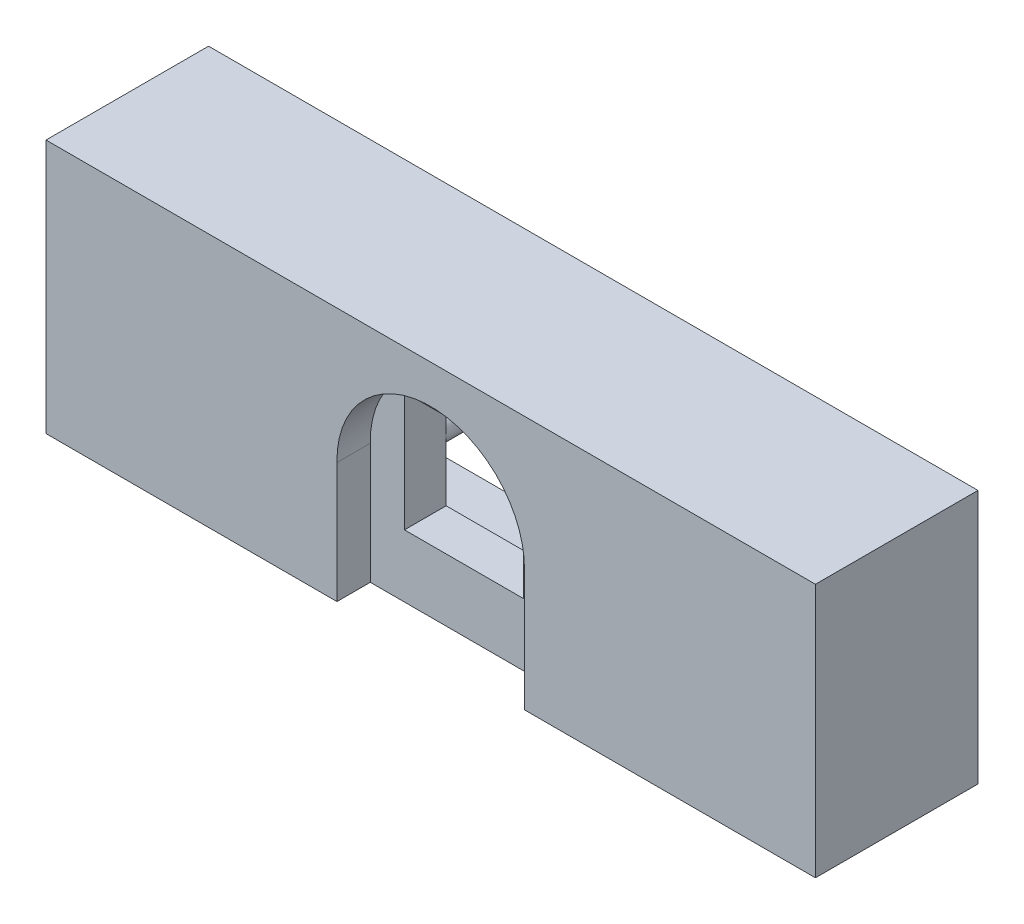
ISO-10303-21;
HEADER;
FILE_DESCRIPTION(('STEP AP214'),'2;1');
FILE_NAME('part.step','',(''),(''),'','','');
FILE_SCHEMA(('AUTOMOTIVE_DESIGN { 1 0 10303 214 1 1 1 1 }'));
ENDSEC;
DATA;
#1=APPLICATION_CONTEXT('core data for automotive mechanical design processes');
#2=APPLICATION_PROTOCOL_DEFINITION('international standard','automotive_design',2000,#1);
#3=PRODUCT_CONTEXT('',#1,'mechanical');
#4=PRODUCT('Part','Part','',(#3));
#5=PRODUCT_RELATED_PRODUCT_CATEGORY('part','',(#4));
#6=PRODUCT_DEFINITION_FORMATION('','',#4);
#7=PRODUCT_DEFINITION_CONTEXT('part definition',#1,'design');
#8=PRODUCT_DEFINITION('design','',#6,#7);
#9=PRODUCT_DEFINITION_SHAPE('','',#8);
#10=(LENGTH_UNIT() NAMED_UNIT(*) SI_UNIT(.MILLI.,.METRE.));
#11=(NAMED_UNIT(*) PLANE_ANGLE_UNIT() SI_UNIT($,.RADIAN.));
#12=(NAMED_UNIT(*) SI_UNIT($,.STERADIAN.) SOLID_ANGLE_UNIT());
#13=UNCERTAINTY_MEASURE_WITH_UNIT(LENGTH_MEASURE(1.E-05),#10,'distance_accuracy_value','');
#14=(GEOMETRIC_REPRESENTATION_CONTEXT(3) GLOBAL_UNCERTAINTY_ASSIGNED_CONTEXT((#13)) GLOBAL_UNIT_ASSIGNED_CONTEXT((#10,
#11,#12)) REPRESENTATION_CONTEXT('',''));
#15=CARTESIAN_POINT('',(0.,0.,0.));
#16=DIRECTION('',(0.,0.,1.));
#17=DIRECTION('',(1.,0.,0.));
#18=AXIS2_PLACEMENT_3D('',#15,#16,#17);
#19=CARTESIAN_POINT('',(0.,0.,4.));
#20=DIRECTION('',(0.,0.,1.));
#21=DIRECTION('',(1.,0.,0.));
#22=AXIS2_PLACEMENT_3D('',#19,#20,#21);
#23=PLANE('',#22);
#24=DIRECTION('',(-1.,0.,0.));
#25=VECTOR('',#24,1.);
#26=CARTESIAN_POINT('',(-14.15,13.85,4.));
#27=LINE('',#26,#25);
#28=CARTESIAN_POINT('',(42.15,13.85,4.));
#29=VERTEX_POINT('',#28);
#30=CARTESIAN_POINT('',(-42.15,13.85,4.));
#31=VERTEX_POINT('',#30);
#32=EDGE_CURVE('E328',#29,#31,#27,.T.);
#33=ORIENTED_EDGE('',*,*,#32,.F.);
#34=DIRECTION('',(0.,-1.,0.));
#35=VECTOR('',#34,1.);
#36=CARTESIAN_POINT('',(42.15,51.3233238451035,4.));
#37=LINE('',#36,#35);
#38=CARTESIAN_POINT('',(42.15,-12.65,4.));
#39=VERTEX_POINT('',#38);
#40=EDGE_CURVE('E253',#29,#39,#37,.T.);
#41=ORIENTED_EDGE('',*,*,#40,.T.);
#42=DIRECTION('',(1.,0.,0.));
#43=VECTOR('',#42,1.);
#44=CARTESIAN_POINT('',(14.15,-12.65,4.));
#45=LINE('',#44,#43);
#46=CARTESIAN_POINT('',(14.15,-12.65,4.));
#47=VERTEX_POINT('',#46);
#48=EDGE_CURVE('E240',#47,#39,#45,.T.);
#49=ORIENTED_EDGE('',*,*,#48,.F.);
#50=DIRECTION('',(0.,1.,0.));
#51=VECTOR('',#50,1.);
#52=CARTESIAN_POINT('',(14.15,-11.15,4.));
#53=LINE('',#52,#51);
#54=CARTESIAN_POINT('',(14.15,12.15,4.));
#55=VERTEX_POINT('',#54);
#56=EDGE_CURVE('E331',#47,#55,#53,.T.);
#57=ORIENTED_EDGE('',*,*,#56,.T.);
#58=DIRECTION('',(-1.,0.,0.));
#59=VECTOR('',#58,1.);
#60=CARTESIAN_POINT('',(-12.15,12.15,4.));
#61=LINE('',#60,#59);
#62=CARTESIAN_POINT('',(-14.15,12.15,4.));
#63=VERTEX_POINT('',#62);
#64=EDGE_CURVE('E11',#55,#63,#61,.T.);
#65=ORIENTED_EDGE('',*,*,#64,.T.);
#66=DIRECTION('',(0.,-1.,0.));
#67=VECTOR('',#66,1.);
#68=CARTESIAN_POINT('',(-14.15,16.6221359549996,4.));
#69=LINE('',#68,#67);
#70=CARTESIAN_POINT('',(-14.15,-12.65,4.));
#71=VERTEX_POINT('',#70);
#72=EDGE_CURVE('E337',#63,#71,#69,.T.);
#73=ORIENTED_EDGE('',*,*,#72,.T.);
#74=DIRECTION('',(1.,0.,0.));
#75=VECTOR('',#74,1.);
#76=CARTESIAN_POINT('',(-14.15,-12.65,4.));
#77=LINE('',#76,#75);
#78=CARTESIAN_POINT('',(-42.15,-12.65,4.));
#79=VERTEX_POINT('',#78);
#80=EDGE_CURVE('E267',#79,#71,#77,.T.);
#81=ORIENTED_EDGE('',*,*,#80,.F.);
#82=DIRECTION('',(0.,-1.,0.));
#83=VECTOR('',#82,1.);
#84=CARTESIAN_POINT('',(-42.15,51.3233238451035,4.));
#85=LINE('',#84,#83);
#86=EDGE_CURVE('E264',#31,#79,#85,.T.);
#87=ORIENTED_EDGE('',*,*,#86,.F.);
#88=EDGE_LOOP('',(#33,#41,#49,#57,#65,#73,#81,#87));
#89=FACE_BOUND('',#88,.T.);
#90=ADVANCED_FACE('F32',(#89),#23,.F.);
#91=CARTESIAN_POINT('',(0.,0.,4.));
#92=DIRECTION('',(0.,0.,1.));
#93=DIRECTION('',(1.,0.,0.));
#94=AXIS2_PLACEMENT_3D('',#91,#92,#93);
#95=PLANE('',#94);
#96=DIRECTION('',(0.,1.,0.));
#97=VECTOR('',#96,1.);
#98=CARTESIAN_POINT('',(-11.2481903363964,-0.201777491806106,4.));
#99=LINE('',#98,#97);
#100=CARTESIAN_POINT('',(-11.2481903363964,-14.65,4.));
#101=VERTEX_POINT('',#100);
#102=CARTESIAN_POINT('',(-11.2481903363964,-0.201777491806106,4.));
#103=VERTEX_POINT('',#102);
#104=EDGE_CURVE('E381',#101,#103,#99,.T.);
#105=ORIENTED_EDGE('',*,*,#104,.F.);
#106=DIRECTION('',(-1.,0.,0.));
#107=VECTOR('',#106,1.);
#108=CARTESIAN_POINT('',(11.2481903363964,-14.65,4.));
#109=LINE('',#108,#107);
#110=CARTESIAN_POINT('',(11.2481903363964,-14.65,4.));
#111=VERTEX_POINT('',#110);
#112=EDGE_CURVE('E204',#111,#101,#109,.T.);
#113=ORIENTED_EDGE('',*,*,#112,.F.);
#114=DIRECTION('',(0.,-1.,0.));
#115=VECTOR('',#114,1.);
#116=CARTESIAN_POINT('',(11.2481903363964,-0.201777491806097,4.));
#117=LINE('',#116,#115);
#118=CARTESIAN_POINT('',(11.2481903363964,-0.2017774918061,4.));
#119=VERTEX_POINT('',#118);
#120=EDGE_CURVE('E49',#119,#111,#117,.T.);
#121=ORIENTED_EDGE('',*,*,#120,.F.);
#122=CARTESIAN_POINT('',(0.,0.,4.));
#123=DIRECTION('',(0.,0.,-1.));
#124=DIRECTION('',(1.,0.,0.));
#125=AXIS2_PLACEMENT_3D('',#122,#123,#124);
#126=CIRCLE('',#125,11.25);
#127=EDGE_CURVE('E53',#103,#119,#126,.T.);
#128=ORIENTED_EDGE('',*,*,#127,.F.);
#129=EDGE_LOOP('',(#105,#113,#121,#128));
#130=FACE_BOUND('',#129,.T.);
#131=DIRECTION('',(-1.,0.,0.));
#132=VECTOR('',#131,1.);
#133=CARTESIAN_POINT('',(-7.15,7.15,4.));
#134=LINE('',#133,#132);
#135=CARTESIAN_POINT('',(7.15,7.15,4.));
#136=VERTEX_POINT('',#135);
#137=CARTESIAN_POINT('',(-7.15,7.15,4.));
#138=VERTEX_POINT('',#137);
#139=EDGE_CURVE('E367',#136,#138,#134,.T.);
#140=ORIENTED_EDGE('',*,*,#139,.F.);
#141=DIRECTION('',(0.,1.,0.));
#142=VECTOR('',#141,1.);
#143=CARTESIAN_POINT('',(7.15,7.15,4.));
#144=LINE('',#143,#142);
#145=CARTESIAN_POINT('',(7.15,-7.15,4.));
#146=VERTEX_POINT('',#145);
#147=EDGE_CURVE('E369',#146,#136,#144,.T.);
#148=ORIENTED_EDGE('',*,*,#147,.F.);
#149=DIRECTION('',(1.,0.,0.));
#150=VECTOR('',#149,1.);
#151=CARTESIAN_POINT('',(-7.15,-7.15,4.));
#152=LINE('',#151,#150);
#153=CARTESIAN_POINT('',(-7.15,-7.15,4.));
#154=VERTEX_POINT('',#153);
#155=EDGE_CURVE('E362',#154,#146,#152,.T.);
#156=ORIENTED_EDGE('',*,*,#155,.F.);
#157=DIRECTION('',(0.,-1.,0.));
#158=VECTOR('',#157,1.);
#159=CARTESIAN_POINT('',(-7.15,7.15,4.));
#160=LINE('',#159,#158);
#161=EDGE_CURVE('E364',#138,#154,#160,.T.);
#162=ORIENTED_EDGE('',*,*,#161,.F.);
#163=EDGE_LOOP('',(#140,#148,#156,#162));
#164=FACE_BOUND('',#163,.T.);
#165=ADVANCED_FACE('F445',(#130,#164),#95,.T.);
#166=CARTESIAN_POINT('',(-12.15,12.15,4.));
#167=DIRECTION('',(0.,-1.,0.));
#168=DIRECTION('',(0.,0.,-1.));
#169=AXIS2_PLACEMENT_3D('',#166,#167,#168);
#170=PLANE('',#169);
#171=DIRECTION('',(0.447213595499959,0.,0.894427190999915));
#172=VECTOR('',#171,1.);
#173=CARTESIAN_POINT('',(14.15,12.15,4.));
#174=LINE('',#173,#172);
#175=CARTESIAN_POINT('',(12.15,12.15,0.));
#176=VERTEX_POINT('',#175);
#177=EDGE_CURVE('E320',#176,#55,#174,.T.);
#178=ORIENTED_EDGE('',*,*,#177,.F.);
#179=DIRECTION('',(0.,0.,1.));
#180=VECTOR('',#179,1.);
#181=CARTESIAN_POINT('',(12.15,12.15,-1.));
#182=LINE('',#181,#180);
#183=CARTESIAN_POINT('',(12.15,12.15,-1.));
#184=VERTEX_POINT('',#183);
#185=EDGE_CURVE('E312',#184,#176,#182,.T.);
#186=ORIENTED_EDGE('',*,*,#185,.F.);
#187=DIRECTION('',(1.,0.,0.));
#188=VECTOR('',#187,1.);
#189=CARTESIAN_POINT('',(-12.15,12.15,-1.));
#190=LINE('',#189,#188);
#191=CARTESIAN_POINT('',(-12.15,12.15,-1.));
#192=VERTEX_POINT('',#191);
#193=EDGE_CURVE('E302',#192,#184,#190,.T.);
#194=ORIENTED_EDGE('',*,*,#193,.F.);
#195=DIRECTION('',(0.,0.,1.));
#196=VECTOR('',#195,1.);
#197=CARTESIAN_POINT('',(-12.15,12.15,-1.));
#198=LINE('',#197,#196);
#199=CARTESIAN_POINT('',(-12.15,12.15,0.));
#200=VERTEX_POINT('',#199);
#201=EDGE_CURVE('E309',#192,#200,#198,.T.);
#202=ORIENTED_EDGE('',*,*,#201,.T.);
#203=DIRECTION('',(0.447213595499957,0.,-0.894427190999917));
#204=VECTOR('',#203,1.);
#205=CARTESIAN_POINT('',(-12.15,12.15,0.));
#206=LINE('',#205,#204);
#207=EDGE_CURVE('E333',#63,#200,#206,.T.);
#208=ORIENTED_EDGE('',*,*,#207,.F.);
#209=ORIENTED_EDGE('',*,*,#64,.F.);
#210=EDGE_LOOP('',(#178,#186,#194,#202,#208,#209));
#211=FACE_BOUND('',#210,.T.);
#212=ADVANCED_FACE('F34',(#211),#170,.F.);
#213=CARTESIAN_POINT('',(7.15,7.15,4.));
#214=DIRECTION('',(-1.,0.,0.));
#215=DIRECTION('',(0.,-1.,0.));
#216=AXIS2_PLACEMENT_3D('',#213,#214,#215);
#217=PLANE('',#216);
#218=DIRECTION('',(0.,0.,-1.));
#219=VECTOR('',#218,1.);
#220=CARTESIAN_POINT('',(7.15,7.15,4.));
#221=LINE('',#220,#219);
#222=CARTESIAN_POINT('',(7.15,7.15,-1.));
#223=VERTEX_POINT('',#222);
#224=EDGE_CURVE('E354',#136,#223,#221,.T.);
#225=ORIENTED_EDGE('',*,*,#224,.T.);
#226=DIRECTION('',(0.,-1.,0.));
#227=VECTOR('',#226,1.);
#228=CARTESIAN_POINT('',(7.15,-7.15,-1.));
#229=LINE('',#228,#227);
#230=CARTESIAN_POINT('',(7.15,-7.15,-1.));
#231=VERTEX_POINT('',#230);
#232=EDGE_CURVE('E290',#223,#231,#229,.T.);
#233=ORIENTED_EDGE('',*,*,#232,.T.);
#234=DIRECTION('',(0.,0.,-1.));
#235=VECTOR('',#234,1.);
#236=CARTESIAN_POINT('',(7.15,-7.15,4.));
#237=LINE('',#236,#235);
#238=EDGE_CURVE('E360',#146,#231,#237,.T.);
#239=ORIENTED_EDGE('',*,*,#238,.F.);
#240=ORIENTED_EDGE('',*,*,#147,.T.);
#241=EDGE_LOOP('',(#225,#233,#239,#240));
#242=FACE_BOUND('',#241,.T.);
#243=ADVANCED_FACE('F435',(#242),#217,.T.);
#244=CARTESIAN_POINT('',(-7.15,7.15,4.));
#245=DIRECTION('',(0.,-1.,0.));
#246=DIRECTION('',(0.,0.,-1.));
#247=AXIS2_PLACEMENT_3D('',#244,#245,#246);
#248=PLANE('',#247);
#249=DIRECTION('',(0.,0.,-1.));
#250=VECTOR('',#249,1.);
#251=CARTESIAN_POINT('',(-7.15,7.15,4.));
#252=LINE('',#251,#250);
#253=CARTESIAN_POINT('',(-7.15,7.15,-1.));
#254=VERTEX_POINT('',#253);
#255=EDGE_CURVE('E356',#138,#254,#252,.T.);
#256=ORIENTED_EDGE('',*,*,#255,.T.);
#257=DIRECTION('',(1.,0.,0.));
#258=VECTOR('',#257,1.);
#259=CARTESIAN_POINT('',(7.15,7.15,-1.));
#260=LINE('',#259,#258);
#261=EDGE_CURVE('E299',#254,#223,#260,.T.);
#262=ORIENTED_EDGE('',*,*,#261,.T.);
#263=ORIENTED_EDGE('',*,*,#224,.F.);
#264=ORIENTED_EDGE('',*,*,#139,.T.);
#265=EDGE_LOOP('',(#256,#262,#263,#264));
#266=FACE_BOUND('',#265,.T.);
#267=ADVANCED_FACE('F439',(#266),#248,.T.);
#268=CARTESIAN_POINT('',(-7.15,7.15,4.));
#269=DIRECTION('',(1.,0.,0.));
#270=DIRECTION('',(0.,1.,0.));
#271=AXIS2_PLACEMENT_3D('',#268,#269,#270);
#272=PLANE('',#271);
#273=DIRECTION('',(0.,0.,-1.));
#274=VECTOR('',#273,1.);
#275=CARTESIAN_POINT('',(-7.15,-7.15,4.));
#276=LINE('',#275,#274);
#277=CARTESIAN_POINT('',(-7.15,-7.15,-1.));
#278=VERTEX_POINT('',#277);
#279=EDGE_CURVE('E358',#154,#278,#276,.T.);
#280=ORIENTED_EDGE('',*,*,#279,.T.);
#281=DIRECTION('',(0.,1.,0.));
#282=VECTOR('',#281,1.);
#283=CARTESIAN_POINT('',(-7.15,7.15,-1.));
#284=LINE('',#283,#282);
#285=EDGE_CURVE('E296',#278,#254,#284,.T.);
#286=ORIENTED_EDGE('',*,*,#285,.T.);
#287=ORIENTED_EDGE('',*,*,#255,.F.);
#288=ORIENTED_EDGE('',*,*,#161,.T.);
#289=EDGE_LOOP('',(#280,#286,#287,#288));
#290=FACE_BOUND('',#289,.T.);
#291=ADVANCED_FACE('F443',(#290),#272,.T.);
#292=CARTESIAN_POINT('',(-7.15,-7.15,4.));
#293=DIRECTION('',(0.,1.,0.));
#294=DIRECTION('',(0.,0.,1.));
#295=AXIS2_PLACEMENT_3D('',#292,#293,#294);
#296=PLANE('',#295);
#297=ORIENTED_EDGE('',*,*,#238,.T.);
#298=DIRECTION('',(-1.,0.,0.));
#299=VECTOR('',#298,1.);
#300=CARTESIAN_POINT('',(-7.15,-7.15,-1.));
#301=LINE('',#300,#299);
#302=EDGE_CURVE('E293',#231,#278,#301,.T.);
#303=ORIENTED_EDGE('',*,*,#302,.T.);
#304=ORIENTED_EDGE('',*,*,#279,.F.);
#305=ORIENTED_EDGE('',*,*,#155,.T.);
#306=EDGE_LOOP('',(#297,#303,#304,#305));
#307=FACE_BOUND('',#306,.T.);
#308=ADVANCED_FACE('F430',(#307),#296,.T.);
#309=CARTESIAN_POINT('',(-11.2481903363964,-0.201777491806106,8.));
#310=DIRECTION('',(-1.,0.,0.));
#311=DIRECTION('',(0.,0.,1.));
#312=AXIS2_PLACEMENT_3D('',#309,#310,#311);
#313=PLANE('',#312);
#314=ORIENTED_EDGE('',*,*,#104,.T.);
#315=DIRECTION('',(0.,0.,-1.));
#316=VECTOR('',#315,1.);
#317=CARTESIAN_POINT('',(-11.2481903363964,-0.201777491806106,8.));
#318=LINE('',#317,#316);
#319=CARTESIAN_POINT('',(-11.2481903363964,-0.201777491806106,8.));
#320=VERTEX_POINT('',#319);
#321=EDGE_CURVE('E186',#320,#103,#318,.T.);
#322=ORIENTED_EDGE('',*,*,#321,.F.);
#323=DIRECTION('',(0.,1.,0.));
#324=VECTOR('',#323,1.);
#325=CARTESIAN_POINT('',(-11.2481903363964,-0.201777491806106,8.));
#326=LINE('',#325,#324);
#327=CARTESIAN_POINT('',(-11.2481903363964,-14.65,8.));
#328=VERTEX_POINT('',#327);
#329=EDGE_CURVE('E180',#328,#320,#326,.T.);
#330=ORIENTED_EDGE('',*,*,#329,.F.);
#331=DIRECTION('',(0.,0.,1.));
#332=VECTOR('',#331,1.);
#333=CARTESIAN_POINT('',(-11.2481903363964,-14.65,4.));
#334=LINE('',#333,#332);
#335=EDGE_CURVE('E184',#101,#328,#334,.T.);
#336=ORIENTED_EDGE('',*,*,#335,.F.);
#337=EDGE_LOOP('',(#314,#322,#330,#336));
#338=FACE_BOUND('',#337,.T.);
#339=ADVANCED_FACE('F182',(#338),#313,.F.);
#340=CARTESIAN_POINT('',(0.,0.,8.));
#341=DIRECTION('',(0.,0.,-1.));
#342=DIRECTION('',(-1.,0.,0.));
#343=AXIS2_PLACEMENT_3D('',#340,#341,#342);
#344=CYLINDRICAL_SURFACE('',#343,11.25);
#345=ORIENTED_EDGE('',*,*,#127,.T.);
#346=DIRECTION('',(0.,0.,-1.));
#347=VECTOR('',#346,1.);
#348=CARTESIAN_POINT('',(11.2481903363964,-0.2017774918061,8.));
#349=LINE('',#348,#347);
#350=CARTESIAN_POINT('',(11.2481903363964,-0.2017774918061,8.));
#351=VERTEX_POINT('',#350);
#352=EDGE_CURVE('E325',#351,#119,#349,.T.);
#353=ORIENTED_EDGE('',*,*,#352,.F.);
#354=CARTESIAN_POINT('',(0.,0.,8.));
#355=DIRECTION('',(0.,0.,-1.));
#356=DIRECTION('',(1.,0.,0.));
#357=AXIS2_PLACEMENT_3D('',#354,#355,#356);
#358=CIRCLE('',#357,11.25);
#359=EDGE_CURVE('E189',#320,#351,#358,.T.);
#360=ORIENTED_EDGE('',*,*,#359,.F.);
#361=ORIENTED_EDGE('',*,*,#321,.T.);
#362=EDGE_LOOP('',(#345,#353,#360,#361));
#363=FACE_BOUND('',#362,.T.);
#364=ADVANCED_FACE('F479',(#363),#344,.F.);
#365=CARTESIAN_POINT('',(11.2481903363964,-0.201777491806097,8.));
#366=DIRECTION('',(1.,0.,0.));
#367=DIRECTION('',(0.,0.,-1.));
#368=AXIS2_PLACEMENT_3D('',#365,#366,#367);
#369=PLANE('',#368);
#370=ORIENTED_EDGE('',*,*,#120,.T.);
#371=DIRECTION('',(0.,0.,-1.));
#372=VECTOR('',#371,1.);
#373=CARTESIAN_POINT('',(11.2481903363964,-14.65,8.));
#374=LINE('',#373,#372);
#375=CARTESIAN_POINT('',(11.2481903363964,-14.65,8.));
#376=VERTEX_POINT('',#375);
#377=EDGE_CURVE('E224',#376,#111,#374,.T.);
#378=ORIENTED_EDGE('',*,*,#377,.F.);
#379=DIRECTION('',(0.,-1.,0.));
#380=VECTOR('',#379,1.);
#381=CARTESIAN_POINT('',(11.2481903363964,-0.201777491806097,8.));
#382=LINE('',#381,#380);
#383=EDGE_CURVE('E323',#351,#376,#382,.T.);
#384=ORIENTED_EDGE('',*,*,#383,.F.);
#385=ORIENTED_EDGE('',*,*,#352,.T.);
#386=EDGE_LOOP('',(#370,#378,#384,#385));
#387=FACE_BOUND('',#386,.T.);
#388=ADVANCED_FACE('F482',(#387),#369,.F.);
#389=CARTESIAN_POINT('',(0.,0.,8.));
#390=DIRECTION('',(0.,0.,1.));
#391=DIRECTION('',(1.,0.,0.));
#392=AXIS2_PLACEMENT_3D('',#389,#390,#391);
#393=PLANE('',#392);
#394=ORIENTED_EDGE('',*,*,#383,.T.);
#395=DIRECTION('',(-1.,0.,0.));
#396=VECTOR('',#395,1.);
#397=CARTESIAN_POINT('',(46.15,-14.65,8.));
#398=LINE('',#397,#396);
#399=CARTESIAN_POINT('',(46.15,-14.65,8.));
#400=VERTEX_POINT('',#399);
#401=EDGE_CURVE('E221',#400,#376,#398,.T.);
#402=ORIENTED_EDGE('',*,*,#401,.F.);
#403=DIRECTION('',(0.,-1.,0.));
#404=VECTOR('',#403,1.);
#405=CARTESIAN_POINT('',(46.15,51.3233238451035,8.));
#406=LINE('',#405,#404);
#407=CARTESIAN_POINT('',(46.15,15.85,8.));
#408=VERTEX_POINT('',#407);
#409=EDGE_CURVE('E247',#408,#400,#406,.T.);
#410=ORIENTED_EDGE('',*,*,#409,.F.);
#411=DIRECTION('',(1.,0.,0.));
#412=VECTOR('',#411,1.);
#413=CARTESIAN_POINT('',(-46.15,15.85,8.));
#414=LINE('',#413,#412);
#415=CARTESIAN_POINT('',(-46.15,15.85,8.));
#416=VERTEX_POINT('',#415);
#417=EDGE_CURVE('E234',#416,#408,#414,.T.);
#418=ORIENTED_EDGE('',*,*,#417,.F.);
#419=DIRECTION('',(0.,-1.,0.));
#420=VECTOR('',#419,1.);
#421=CARTESIAN_POINT('',(-46.15,51.3233238451035,8.));
#422=LINE('',#421,#420);
#423=CARTESIAN_POINT('',(-46.15,-14.65,8.));
#424=VERTEX_POINT('',#423);
#425=EDGE_CURVE('E195',#416,#424,#422,.T.);
#426=ORIENTED_EDGE('',*,*,#425,.T.);
#427=DIRECTION('',(-1.,0.,0.));
#428=VECTOR('',#427,1.);
#429=CARTESIAN_POINT('',(-11.2481903363964,-14.65,8.));
#430=LINE('',#429,#428);
#431=EDGE_CURVE('E192',#328,#424,#430,.T.);
#432=ORIENTED_EDGE('',*,*,#431,.F.);
#433=ORIENTED_EDGE('',*,*,#329,.T.);
#434=ORIENTED_EDGE('',*,*,#359,.T.);
#435=EDGE_LOOP('',(#394,#402,#410,#418,#426,#432,#433,#434));
#436=FACE_BOUND('',#435,.T.);
#437=ADVANCED_FACE('F193',(#436),#393,.T.);
#438=CARTESIAN_POINT('',(-12.15,16.6221359549996,0.));
#439=DIRECTION('',(0.894427190999916,0.,0.447213595499957));
#440=DIRECTION('',(0.447213595499957,0.,-0.894427190999917));
#441=AXIS2_PLACEMENT_3D('',#438,#439,#440);
#442=PLANE('',#441);
#443=ORIENTED_EDGE('',*,*,#72,.F.);
#444=ORIENTED_EDGE('',*,*,#207,.T.);
#445=DIRECTION('',(0.,-1.,0.));
#446=VECTOR('',#445,1.);
#447=CARTESIAN_POINT('',(-12.15,12.15,0.));
#448=LINE('',#447,#446);
#449=CARTESIAN_POINT('',(-12.15,-12.65,0.));
#450=VERTEX_POINT('',#449);
#451=EDGE_CURVE('E41',#200,#450,#448,.T.);
#452=ORIENTED_EDGE('',*,*,#451,.T.);
#453=DIRECTION('',(0.447213595499957,0.,-0.894427190999916));
#454=VECTOR('',#453,1.);
#455=CARTESIAN_POINT('',(-14.15,-12.65,4.));
#456=LINE('',#455,#454);
#457=EDGE_CURVE('E263',#71,#450,#456,.T.);
#458=ORIENTED_EDGE('',*,*,#457,.F.);
#459=EDGE_LOOP('',(#443,#444,#452,#458));
#460=FACE_BOUND('',#459,.T.);
#461=ADVANCED_FACE('F415',(#460),#442,.F.);
#462=CARTESIAN_POINT('',(14.15,16.6221359549996,4.));
#463=DIRECTION('',(-0.894427190999915,0.,0.447213595499959));
#464=DIRECTION('',(0.447213595499959,0.,0.894427190999915));
#465=AXIS2_PLACEMENT_3D('',#462,#463,#464);
#466=PLANE('',#465);
#467=DIRECTION('',(0.,-1.,0.));
#468=VECTOR('',#467,1.);
#469=CARTESIAN_POINT('',(12.15,16.6221359549996,0.));
#470=LINE('',#469,#468);
#471=CARTESIAN_POINT('',(12.15,-12.65,0.));
#472=VERTEX_POINT('',#471);
#473=EDGE_CURVE('E319',#176,#472,#470,.T.);
#474=ORIENTED_EDGE('',*,*,#473,.F.);
#475=ORIENTED_EDGE('',*,*,#177,.T.);
#476=ORIENTED_EDGE('',*,*,#56,.F.);
#477=DIRECTION('',(0.447213595499959,0.,0.894427190999915));
#478=VECTOR('',#477,1.);
#479=CARTESIAN_POINT('',(12.15,-12.65,0.));
#480=LINE('',#479,#478);
#481=EDGE_CURVE('E287',#472,#47,#480,.T.);
#482=ORIENTED_EDGE('',*,*,#481,.F.);
#483=EDGE_LOOP('',(#474,#475,#476,#482));
#484=FACE_BOUND('',#483,.T.);
#485=ADVANCED_FACE('F403',(#484),#466,.F.);
#486=CARTESIAN_POINT('',(0.,0.,-1.));
#487=DIRECTION('',(0.,0.,-1.));
#488=DIRECTION('',(-1.,0.,0.));
#489=AXIS2_PLACEMENT_3D('',#486,#487,#488);
#490=PLANE('',#489);
#491=CARTESIAN_POINT('',(-8.75,0.,-1.));
#492=DIRECTION('',(0.,0.,-1.));
#493=DIRECTION('',(-1.,0.,0.));
#494=AXIS2_PLACEMENT_3D('',#491,#492,#493);
#495=CIRCLE('',#494,1.5);
#496=CARTESIAN_POINT('',(-10.25,0.,-1.));
#497=VERTEX_POINT('',#496);
#498=EDGE_CURVE('E316',#497,#497,#495,.T.);
#499=ORIENTED_EDGE('',*,*,#498,.F.);
#500=EDGE_LOOP('',(#499));
#501=FACE_BOUND('',#500,.T.);
#502=CARTESIAN_POINT('',(8.75,0.,-1.));
#503=DIRECTION('',(0.,0.,-1.));
#504=DIRECTION('',(-1.,0.,0.));
#505=AXIS2_PLACEMENT_3D('',#502,#503,#504);
#506=CIRCLE('',#505,1.5);
#507=CARTESIAN_POINT('',(7.25,0.,-1.));
#508=VERTEX_POINT('',#507);
#509=EDGE_CURVE('E315',#508,#508,#506,.T.);
#510=ORIENTED_EDGE('',*,*,#509,.F.);
#511=EDGE_LOOP('',(#510));
#512=FACE_BOUND('',#511,.T.);
#513=ORIENTED_EDGE('',*,*,#193,.T.);
#514=DIRECTION('',(0.,-1.,0.));
#515=VECTOR('',#514,1.);
#516=CARTESIAN_POINT('',(12.15,12.15,-1.));
#517=LINE('',#516,#515);
#518=CARTESIAN_POINT('',(12.15,-12.65,-1.));
#519=VERTEX_POINT('',#518);
#520=EDGE_CURVE('E305',#184,#519,#517,.T.);
#521=ORIENTED_EDGE('',*,*,#520,.T.);
#522=DIRECTION('',(1.,0.,0.));
#523=VECTOR('',#522,1.);
#524=CARTESIAN_POINT('',(-12.15,-12.65,-1.));
#525=LINE('',#524,#523);
#526=CARTESIAN_POINT('',(-12.15,-12.65,-1.));
#527=VERTEX_POINT('',#526);
#528=EDGE_CURVE('E281',#527,#519,#525,.T.);
#529=ORIENTED_EDGE('',*,*,#528,.F.);
#530=DIRECTION('',(0.,1.,0.));
#531=VECTOR('',#530,1.);
#532=CARTESIAN_POINT('',(-12.15,-11.15,-1.));
#533=LINE('',#532,#531);
#534=EDGE_CURVE('E307',#527,#192,#533,.T.);
#535=ORIENTED_EDGE('',*,*,#534,.T.);
#536=EDGE_LOOP('',(#513,#521,#529,#535));
#537=FACE_BOUND('',#536,.T.);
#538=ORIENTED_EDGE('',*,*,#302,.F.);
#539=ORIENTED_EDGE('',*,*,#232,.F.);
#540=ORIENTED_EDGE('',*,*,#261,.F.);
#541=ORIENTED_EDGE('',*,*,#285,.F.);
#542=EDGE_LOOP('',(#538,#539,#540,#541));
#543=FACE_BOUND('',#542,.T.);
#544=ADVANCED_FACE('F420',(#501,#512,#537,#543),#490,.T.);
#545=CARTESIAN_POINT('',(12.15,12.15,-1.));
#546=DIRECTION('',(-1.,0.,0.));
#547=DIRECTION('',(0.,0.,1.));
#548=AXIS2_PLACEMENT_3D('',#545,#546,#547);
#549=PLANE('',#548);
#550=ORIENTED_EDGE('',*,*,#473,.T.);
#551=DIRECTION('',(0.,0.,1.));
#552=VECTOR('',#551,1.);
#553=CARTESIAN_POINT('',(12.15,-12.65,-1.));
#554=LINE('',#553,#552);
#555=EDGE_CURVE('E284',#519,#472,#554,.T.);
#556=ORIENTED_EDGE('',*,*,#555,.F.);
#557=ORIENTED_EDGE('',*,*,#520,.F.);
#558=ORIENTED_EDGE('',*,*,#185,.T.);
#559=EDGE_LOOP('',(#550,#556,#557,#558));
#560=FACE_BOUND('',#559,.T.);
#561=ADVANCED_FACE('F407',(#560),#549,.F.);
#562=CARTESIAN_POINT('',(-12.15,-11.15,-1.));
#563=DIRECTION('',(1.,0.,0.));
#564=DIRECTION('',(0.,0.,-1.));
#565=AXIS2_PLACEMENT_3D('',#562,#563,#564);
#566=PLANE('',#565);
#567=ORIENTED_EDGE('',*,*,#451,.F.);
#568=ORIENTED_EDGE('',*,*,#201,.F.);
#569=ORIENTED_EDGE('',*,*,#534,.F.);
#570=DIRECTION('',(0.,0.,-1.));
#571=VECTOR('',#570,1.);
#572=CARTESIAN_POINT('',(-12.15,-12.65,0.));
#573=LINE('',#572,#571);
#574=EDGE_CURVE('E278',#450,#527,#573,.T.);
#575=ORIENTED_EDGE('',*,*,#574,.F.);
#576=EDGE_LOOP('',(#567,#568,#569,#575));
#577=FACE_BOUND('',#576,.T.);
#578=ADVANCED_FACE('F418',(#577),#566,.F.);
#579=CARTESIAN_POINT('',(8.75,0.,-4.));
#580=DIRECTION('',(0.,0.,1.));
#581=DIRECTION('',(1.,0.,0.));
#582=AXIS2_PLACEMENT_3D('',#579,#580,#581);
#583=PLANE('',#582);
#584=CARTESIAN_POINT('',(8.75,0.,-4.));
#585=DIRECTION('',(0.,0.,-1.));
#586=DIRECTION('',(1.,0.,0.));
#587=AXIS2_PLACEMENT_3D('',#584,#585,#586);
#588=CIRCLE('',#587,1.5);
#589=CARTESIAN_POINT('',(10.25,0.,-4.));
#590=VERTEX_POINT('',#589);
#591=EDGE_CURVE('E374',#590,#590,#588,.T.);
#592=ORIENTED_EDGE('',*,*,#591,.T.);
#593=EDGE_LOOP('',(#592));
#594=FACE_BOUND('',#593,.T.);
#595=ADVANCED_FACE('F473',(#594),#583,.F.);
#596=CARTESIAN_POINT('',(8.75,0.,-4.));
#597=DIRECTION('',(0.,0.,1.));
#598=DIRECTION('',(1.,0.,0.));
#599=AXIS2_PLACEMENT_3D('',#596,#597,#598);
#600=CYLINDRICAL_SURFACE('',#599,1.5);
#601=ORIENTED_EDGE('',*,*,#509,.T.);
#602=EDGE_LOOP('',(#601));
#603=FACE_BOUND('',#602,.T.);
#604=ORIENTED_EDGE('',*,*,#591,.F.);
#605=EDGE_LOOP('',(#604));
#606=FACE_BOUND('',#605,.T.);
#607=ADVANCED_FACE('F469',(#603,#606),#600,.T.);
#608=CARTESIAN_POINT('',(-8.75,0.,-4.));
#609=DIRECTION('',(0.,0.,-1.));
#610=DIRECTION('',(-1.,0.,0.));
#611=AXIS2_PLACEMENT_3D('',#608,#609,#610);
#612=PLANE('',#611);
#613=CARTESIAN_POINT('',(-8.75,0.,-4.));
#614=DIRECTION('',(0.,0.,-1.));
#615=DIRECTION('',(-1.,0.,0.));
#616=AXIS2_PLACEMENT_3D('',#613,#614,#615);
#617=CIRCLE('',#616,1.5);
#618=CARTESIAN_POINT('',(-10.25,0.,-4.));
#619=VERTEX_POINT('',#618);
#620=EDGE_CURVE('E371',#619,#619,#617,.T.);
#621=ORIENTED_EDGE('',*,*,#620,.T.);
#622=EDGE_LOOP('',(#621));
#623=FACE_BOUND('',#622,.T.);
#624=ADVANCED_FACE('F465',(#623),#612,.T.);
#625=CARTESIAN_POINT('',(-8.75,0.,-4.));
#626=DIRECTION('',(0.,0.,1.));
#627=DIRECTION('',(1.,0.,0.));
#628=AXIS2_PLACEMENT_3D('',#625,#626,#627);
#629=CYLINDRICAL_SURFACE('',#628,1.5);
#630=ORIENTED_EDGE('',*,*,#498,.T.);
#631=EDGE_LOOP('',(#630));
#632=FACE_BOUND('',#631,.T.);
#633=ORIENTED_EDGE('',*,*,#620,.F.);
#634=EDGE_LOOP('',(#633));
#635=FACE_BOUND('',#634,.T.);
#636=ADVANCED_FACE('F462',(#632,#635),#629,.T.);
#637=CARTESIAN_POINT('',(-42.15,51.3233238451035,4.));
#638=DIRECTION('',(1.,0.,0.));
#639=DIRECTION('',(0.,1.,0.));
#640=AXIS2_PLACEMENT_3D('',#637,#638,#639);
#641=PLANE('',#640);
#642=DIRECTION('',(0.,0.,-1.));
#643=VECTOR('',#642,1.);
#644=CARTESIAN_POINT('',(-42.15,13.85,4.));
#645=LINE('',#644,#643);
#646=CARTESIAN_POINT('',(-42.15,13.85,-11.5));
#647=VERTEX_POINT('',#646);
#648=EDGE_CURVE('E260',#31,#647,#645,.T.);
#649=ORIENTED_EDGE('',*,*,#648,.F.);
#650=ORIENTED_EDGE('',*,*,#86,.T.);
#651=DIRECTION('',(0.,0.,1.));
#652=VECTOR('',#651,1.);
#653=CARTESIAN_POINT('',(-42.15,-12.65,4.));
#654=LINE('',#653,#652);
#655=CARTESIAN_POINT('',(-42.15,-12.65,-11.5));
#656=VERTEX_POINT('',#655);
#657=EDGE_CURVE('E246',#656,#79,#654,.T.);
#658=ORIENTED_EDGE('',*,*,#657,.F.);
#659=DIRECTION('',(0.,-1.,0.));
#660=VECTOR('',#659,1.);
#661=CARTESIAN_POINT('',(-42.15,51.3233238451035,-11.5));
#662=LINE('',#661,#660);
#663=EDGE_CURVE('E271',#647,#656,#662,.T.);
#664=ORIENTED_EDGE('',*,*,#663,.F.);
#665=EDGE_LOOP('',(#649,#650,#658,#664));
#666=FACE_BOUND('',#665,.T.);
#667=ADVANCED_FACE('F391',(#666),#641,.T.);
#668=CARTESIAN_POINT('',(-46.15,51.3233238451035,-11.5));
#669=DIRECTION('',(0.,0.,-1.));
#670=DIRECTION('',(-1.,0.,0.));
#671=AXIS2_PLACEMENT_3D('',#668,#669,#670);
#672=PLANE('',#671);
#673=ORIENTED_EDGE('',*,*,#663,.T.);
#674=DIRECTION('',(1.,0.,0.));
#675=VECTOR('',#674,1.);
#676=CARTESIAN_POINT('',(42.15,-12.65,-11.5));
#677=LINE('',#676,#675);
#678=CARTESIAN_POINT('',(42.15,-12.65,-11.5));
#679=VERTEX_POINT('',#678);
#680=EDGE_CURVE('E205',#656,#679,#677,.T.);
#681=ORIENTED_EDGE('',*,*,#680,.T.);
#682=DIRECTION('',(0.,-1.,0.));
#683=VECTOR('',#682,1.);
#684=CARTESIAN_POINT('',(42.15,51.3233238451035,-11.5));
#685=LINE('',#684,#683);
#686=CARTESIAN_POINT('',(42.15,13.85,-11.5));
#687=VERTEX_POINT('',#686);
#688=EDGE_CURVE('E257',#687,#679,#685,.T.);
#689=ORIENTED_EDGE('',*,*,#688,.F.);
#690=DIRECTION('',(-1.,0.,0.));
#691=VECTOR('',#690,1.);
#692=CARTESIAN_POINT('',(-42.15,13.85,-11.5));
#693=LINE('',#692,#691);
#694=EDGE_CURVE('E226',#687,#647,#693,.T.);
#695=ORIENTED_EDGE('',*,*,#694,.T.);
#696=EDGE_LOOP('',(#673,#681,#689,#695));
#697=FACE_BOUND('',#696,.T.);
#698=DIRECTION('',(0.,-1.,0.));
#699=VECTOR('',#698,1.);
#700=CARTESIAN_POINT('',(-46.15,51.3233238451035,-11.5));
#701=LINE('',#700,#699);
#702=CARTESIAN_POINT('',(-46.15,15.85,-11.5));
#703=VERTEX_POINT('',#702);
#704=CARTESIAN_POINT('',(-46.15,-14.65,-11.5));
#705=VERTEX_POINT('',#704);
#706=EDGE_CURVE('E273',#703,#705,#701,.T.);
#707=ORIENTED_EDGE('',*,*,#706,.F.);
#708=DIRECTION('',(-1.,0.,0.));
#709=VECTOR('',#708,1.);
#710=CARTESIAN_POINT('',(46.15,15.85,-11.5));
#711=LINE('',#710,#709);
#712=CARTESIAN_POINT('',(46.15,15.85,-11.5));
#713=VERTEX_POINT('',#712);
#714=EDGE_CURVE('E228',#713,#703,#711,.T.);
#715=ORIENTED_EDGE('',*,*,#714,.F.);
#716=DIRECTION('',(0.,-1.,0.));
#717=VECTOR('',#716,1.);
#718=CARTESIAN_POINT('',(46.15,51.3233238451035,-11.5));
#719=LINE('',#718,#717);
#720=CARTESIAN_POINT('',(46.15,-14.65,-11.5));
#721=VERTEX_POINT('',#720);
#722=EDGE_CURVE('E255',#713,#721,#719,.T.);
#723=ORIENTED_EDGE('',*,*,#722,.T.);
#724=DIRECTION('',(1.,0.,0.));
#725=VECTOR('',#724,1.);
#726=CARTESIAN_POINT('',(-46.15,-14.65,-11.5));
#727=LINE('',#726,#725);
#728=EDGE_CURVE('E215',#705,#721,#727,.T.);
#729=ORIENTED_EDGE('',*,*,#728,.F.);
#730=EDGE_LOOP('',(#707,#715,#723,#729));
#731=FACE_BOUND('',#730,.T.);
#732=ADVANCED_FACE('F394',(#697,#731),#672,.T.);
#733=CARTESIAN_POINT('',(-46.15,51.3233238451035,8.));
#734=DIRECTION('',(-1.,0.,0.));
#735=DIRECTION('',(0.,-1.,0.));
#736=AXIS2_PLACEMENT_3D('',#733,#734,#735);
#737=PLANE('',#736);
#738=ORIENTED_EDGE('',*,*,#425,.F.);
#739=DIRECTION('',(0.,0.,1.));
#740=VECTOR('',#739,1.);
#741=CARTESIAN_POINT('',(-46.15,15.85,-11.5));
#742=LINE('',#741,#740);
#743=EDGE_CURVE('E231',#703,#416,#742,.T.);
#744=ORIENTED_EDGE('',*,*,#743,.F.);
#745=ORIENTED_EDGE('',*,*,#706,.T.);
#746=DIRECTION('',(0.,0.,-1.));
#747=VECTOR('',#746,1.);
#748=CARTESIAN_POINT('',(-46.15,-14.65,8.));
#749=LINE('',#748,#747);
#750=EDGE_CURVE('E199',#424,#705,#749,.T.);
#751=ORIENTED_EDGE('',*,*,#750,.F.);
#752=EDGE_LOOP('',(#738,#744,#745,#751));
#753=FACE_BOUND('',#752,.T.);
#754=ADVANCED_FACE('F497',(#753),#737,.T.);
#755=CARTESIAN_POINT('',(46.15,51.3233238451035,8.));
#756=DIRECTION('',(1.,0.,0.));
#757=DIRECTION('',(0.,1.,0.));
#758=AXIS2_PLACEMENT_3D('',#755,#756,#757);
#759=PLANE('',#758);
#760=ORIENTED_EDGE('',*,*,#722,.F.);
#761=DIRECTION('',(0.,0.,-1.));
#762=VECTOR('',#761,1.);
#763=CARTESIAN_POINT('',(46.15,15.85,8.));
#764=LINE('',#763,#762);
#765=EDGE_CURVE('E237',#408,#713,#764,.T.);
#766=ORIENTED_EDGE('',*,*,#765,.F.);
#767=ORIENTED_EDGE('',*,*,#409,.T.);
#768=DIRECTION('',(0.,0.,1.));
#769=VECTOR('',#768,1.);
#770=CARTESIAN_POINT('',(46.15,-14.65,-11.5));
#771=LINE('',#770,#769);
#772=EDGE_CURVE('E218',#721,#400,#771,.T.);
#773=ORIENTED_EDGE('',*,*,#772,.F.);
#774=EDGE_LOOP('',(#760,#766,#767,#773));
#775=FACE_BOUND('',#774,.T.);
#776=ADVANCED_FACE('F500',(#775),#759,.T.);
#777=CARTESIAN_POINT('',(42.15,51.3233238451035,4.));
#778=DIRECTION('',(-1.,0.,0.));
#779=DIRECTION('',(0.,-1.,0.));
#780=AXIS2_PLACEMENT_3D('',#777,#778,#779);
#781=PLANE('',#780);
#782=DIRECTION('',(0.,0.,1.));
#783=VECTOR('',#782,1.);
#784=CARTESIAN_POINT('',(42.15,13.85,4.));
#785=LINE('',#784,#783);
#786=EDGE_CURVE('E243',#687,#29,#785,.T.);
#787=ORIENTED_EDGE('',*,*,#786,.F.);
#788=ORIENTED_EDGE('',*,*,#688,.T.);
#789=DIRECTION('',(0.,0.,-1.));
#790=VECTOR('',#789,1.);
#791=CARTESIAN_POINT('',(42.15,-12.65,4.));
#792=LINE('',#791,#790);
#793=EDGE_CURVE('E250',#39,#679,#792,.T.);
#794=ORIENTED_EDGE('',*,*,#793,.F.);
#795=ORIENTED_EDGE('',*,*,#40,.F.);
#796=EDGE_LOOP('',(#787,#788,#794,#795));
#797=FACE_BOUND('',#796,.T.);
#798=ADVANCED_FACE('F398',(#797),#781,.T.);
#799=CARTESIAN_POINT('',(0.,13.85,0.));
#800=DIRECTION('',(0.,1.,0.));
#801=DIRECTION('',(0.,0.,1.));
#802=AXIS2_PLACEMENT_3D('',#799,#800,#801);
#803=PLANE('',#802);
#804=ORIENTED_EDGE('',*,*,#32,.T.);
#805=ORIENTED_EDGE('',*,*,#648,.T.);
#806=ORIENTED_EDGE('',*,*,#694,.F.);
#807=ORIENTED_EDGE('',*,*,#786,.T.);
#808=EDGE_LOOP('',(#804,#805,#806,#807));
#809=FACE_BOUND('',#808,.T.);
#810=ADVANCED_FACE('F385',(#809),#803,.F.);
#811=CARTESIAN_POINT('',(0.,15.85,0.));
#812=DIRECTION('',(0.,1.,0.));
#813=DIRECTION('',(0.,0.,1.));
#814=AXIS2_PLACEMENT_3D('',#811,#812,#813);
#815=PLANE('',#814);
#816=ORIENTED_EDGE('',*,*,#714,.T.);
#817=ORIENTED_EDGE('',*,*,#743,.T.);
#818=ORIENTED_EDGE('',*,*,#417,.T.);
#819=ORIENTED_EDGE('',*,*,#765,.T.);
#820=EDGE_LOOP('',(#816,#817,#818,#819));
#821=FACE_BOUND('',#820,.T.);
#822=ADVANCED_FACE('F513',(#821),#815,.T.);
#823=CARTESIAN_POINT('',(0.,-12.65,0.));
#824=DIRECTION('',(0.,-1.,0.));
#825=DIRECTION('',(1.,0.,0.));
#826=AXIS2_PLACEMENT_3D('',#823,#824,#825);
#827=PLANE('',#826);
#828=CARTESIAN_POINT('',(26.2481903363964,-12.65,-7.5));
#829=DIRECTION('',(0.,-1.,0.));
#830=DIRECTION('',(1.,0.,0.));
#831=AXIS2_PLACEMENT_3D('',#828,#829,#830);
#832=CIRCLE('',#831,1.6);
#833=CARTESIAN_POINT('',(27.8481903363964,-12.65,-7.5));
#834=VERTEX_POINT('',#833);
#835=EDGE_CURVE('E208',#834,#834,#832,.T.);
#836=ORIENTED_EDGE('',*,*,#835,.T.);
#837=EDGE_LOOP('',(#836));
#838=FACE_BOUND('',#837,.T.);
#839=ORIENTED_EDGE('',*,*,#680,.F.);
#840=ORIENTED_EDGE('',*,*,#657,.T.);
#841=ORIENTED_EDGE('',*,*,#80,.T.);
#842=ORIENTED_EDGE('',*,*,#457,.T.);
#843=ORIENTED_EDGE('',*,*,#574,.T.);
#844=ORIENTED_EDGE('',*,*,#528,.T.);
#845=ORIENTED_EDGE('',*,*,#555,.T.);
#846=ORIENTED_EDGE('',*,*,#481,.T.);
#847=ORIENTED_EDGE('',*,*,#48,.T.);
#848=ORIENTED_EDGE('',*,*,#793,.T.);
#849=EDGE_LOOP('',(#839,#840,#841,#842,#843,#844,#845,#846,#847,#848));
#850=FACE_BOUND('',#849,.T.);
#851=ADVANCED_FACE('F400',(#838,#850),#827,.F.);
#852=CARTESIAN_POINT('',(0.,-14.65,0.));
#853=DIRECTION('',(0.,-1.,0.));
#854=DIRECTION('',(1.,0.,0.));
#855=AXIS2_PLACEMENT_3D('',#852,#853,#854);
#856=PLANE('',#855);
#857=CARTESIAN_POINT('',(26.2481903363964,-14.65,-7.5));
#858=DIRECTION('',(0.,-1.,0.));
#859=DIRECTION('',(1.,0.,0.));
#860=AXIS2_PLACEMENT_3D('',#857,#858,#859);
#861=CIRCLE('',#860,1.6);
#862=CARTESIAN_POINT('',(27.8481903363964,-14.65,-7.5));
#863=VERTEX_POINT('',#862);
#864=EDGE_CURVE('E211',#863,#863,#861,.T.);
#865=ORIENTED_EDGE('',*,*,#864,.F.);
#866=EDGE_LOOP('',(#865));
#867=FACE_BOUND('',#866,.T.);
#868=ORIENTED_EDGE('',*,*,#335,.T.);
#869=ORIENTED_EDGE('',*,*,#431,.T.);
#870=ORIENTED_EDGE('',*,*,#750,.T.);
#871=ORIENTED_EDGE('',*,*,#728,.T.);
#872=ORIENTED_EDGE('',*,*,#772,.T.);
#873=ORIENTED_EDGE('',*,*,#401,.T.);
#874=ORIENTED_EDGE('',*,*,#377,.T.);
#875=ORIENTED_EDGE('',*,*,#112,.T.);
#876=EDGE_LOOP('',(#868,#869,#870,#871,#872,#873,#874,#875));
#877=FACE_BOUND('',#876,.T.);
#878=ADVANCED_FACE('F202',(#867,#877),#856,.T.);
#879=CARTESIAN_POINT('',(26.2481903363964,-12.65,-7.5));
#880=DIRECTION('',(0.,-1.,0.));
#881=DIRECTION('',(1.,0.,0.));
#882=AXIS2_PLACEMENT_3D('',#879,#880,#881);
#883=CYLINDRICAL_SURFACE('',#882,1.6);
#884=ORIENTED_EDGE('',*,*,#835,.F.);
#885=EDGE_LOOP('',(#884));
#886=FACE_BOUND('',#885,.T.);
#887=ORIENTED_EDGE('',*,*,#864,.T.);
#888=EDGE_LOOP('',(#887));
#889=FACE_BOUND('',#888,.T.);
#890=ADVANCED_FACE('F522',(#886,#889),#883,.F.);
#891=CLOSED_SHELL('',(#90,#165,#212,#243,#267,#291,#308,#339,#364,#388,#437,#461,#485,#544,#561,
#578,#595,#607,#624,#636,#667,#732,#754,#776,#798,#810,#822,#851,#878,#890));
#892=MANIFOLD_SOLID_BREP('B2',#891);
#893=ADVANCED_BREP_SHAPE_REPRESENTATION('',(#18,#892),#14);
#894=SHAPE_DEFINITION_REPRESENTATION(#9,#893);
ENDSEC;
END-ISO-10303-21;
